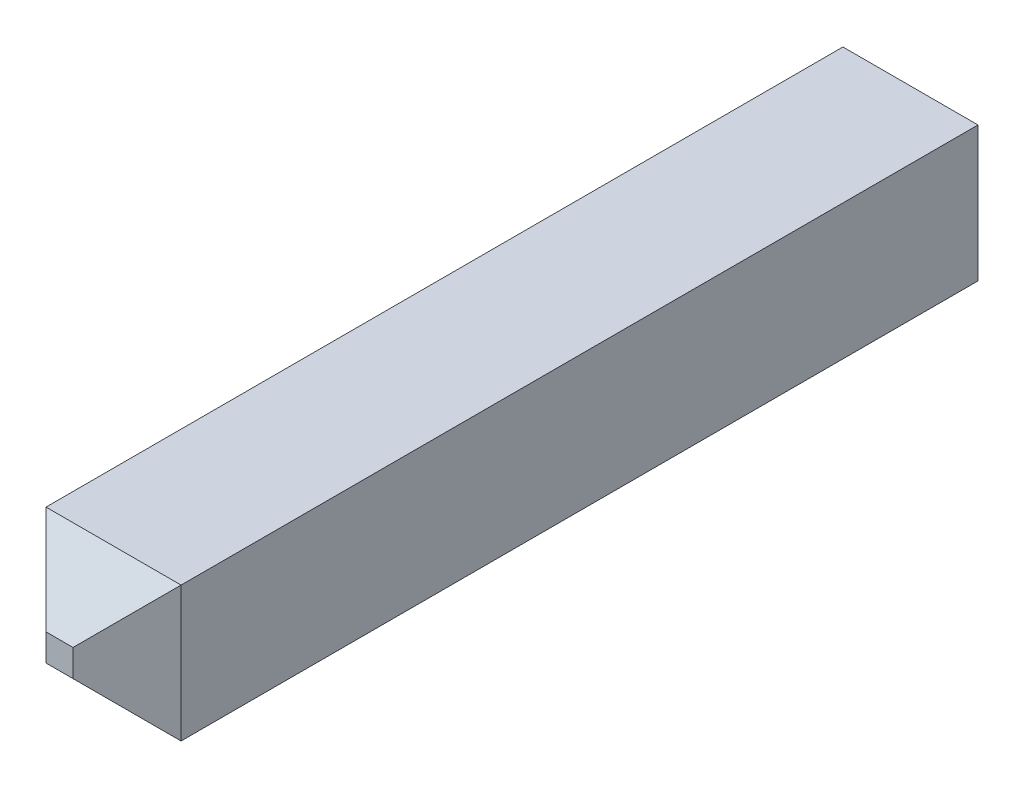
ISO-10303-21;
HEADER;
FILE_DESCRIPTION(('STEP AP214'),'2;1');
FILE_NAME('part.step','',(''),(''),'','','');
FILE_SCHEMA(('AUTOMOTIVE_DESIGN { 1 0 10303 214 1 1 1 1 }'));
ENDSEC;
DATA;
#1=APPLICATION_CONTEXT('core data for automotive mechanical design processes');
#2=APPLICATION_PROTOCOL_DEFINITION('international standard','automotive_design',2000,#1);
#3=PRODUCT_CONTEXT('',#1,'mechanical');
#4=PRODUCT('Part','Part','',(#3));
#5=PRODUCT_RELATED_PRODUCT_CATEGORY('part','',(#4));
#6=PRODUCT_DEFINITION_FORMATION('','',#4);
#7=PRODUCT_DEFINITION_CONTEXT('part definition',#1,'design');
#8=PRODUCT_DEFINITION('design','',#6,#7);
#9=PRODUCT_DEFINITION_SHAPE('','',#8);
#10=(LENGTH_UNIT() NAMED_UNIT(*) SI_UNIT(.MILLI.,.METRE.));
#11=(NAMED_UNIT(*) PLANE_ANGLE_UNIT() SI_UNIT($,.RADIAN.));
#12=(NAMED_UNIT(*) SI_UNIT($,.STERADIAN.) SOLID_ANGLE_UNIT());
#13=UNCERTAINTY_MEASURE_WITH_UNIT(LENGTH_MEASURE(1.E-05),#10,'distance_accuracy_value','');
#14=(GEOMETRIC_REPRESENTATION_CONTEXT(3) GLOBAL_UNCERTAINTY_ASSIGNED_CONTEXT((#13)) GLOBAL_UNIT_ASSIGNED_CONTEXT((#10,
#11,#12)) REPRESENTATION_CONTEXT('',''));
#15=CARTESIAN_POINT('',(0.,0.,0.));
#16=DIRECTION('',(0.,0.,1.));
#17=DIRECTION('',(1.,0.,0.));
#18=AXIS2_PLACEMENT_3D('',#15,#16,#17);
#19=CARTESIAN_POINT('',(-2.625,-2.9,3.05));
#20=DIRECTION('',(0.,-0.707106781186548,0.707106781186548));
#21=DIRECTION('',(0.,-0.707106781186548,-0.707106781186548));
#22=AXIS2_PLACEMENT_3D('',#19,#20,#21);
#23=PLANE('',#22);
#24=DIRECTION('',(1.,0.,0.));
#25=VECTOR('',#24,1.);
#26=CARTESIAN_POINT('',(-2.5,-3.,2.95));
#27=LINE('',#26,#25);
#28=CARTESIAN_POINT('',(-2.5,-3.,2.95));
#29=VERTEX_POINT('',#28);
#30=CARTESIAN_POINT('',(-3.,-3.,2.95));
#31=VERTEX_POINT('',#30);
#32=EDGE_CURVE('E78',#29,#31,#27,.F.);
#33=ORIENTED_EDGE('',*,*,#32,.F.);
#34=DIRECTION('',(0.577350269189625,-0.577350269189628,-0.577350269189625));
#35=VECTOR('',#34,1.);
#36=CARTESIAN_POINT('',(-2.7,-2.8,3.15));
#37=LINE('',#36,#35);
#38=CARTESIAN_POINT('',(-2.7,-2.8,3.15));
#39=VERTEX_POINT('',#38);
#40=EDGE_CURVE('E76',#39,#29,#37,.T.);
#41=ORIENTED_EDGE('',*,*,#40,.F.);
#42=DIRECTION('',(1.,0.,0.));
#43=VECTOR('',#42,1.);
#44=CARTESIAN_POINT('',(-2.75,-2.8,3.15));
#45=LINE('',#44,#43);
#46=CARTESIAN_POINT('',(-2.8,-2.8,3.15));
#47=VERTEX_POINT('',#46);
#48=EDGE_CURVE('E19',#47,#39,#45,.T.);
#49=ORIENTED_EDGE('',*,*,#48,.F.);
#50=DIRECTION('',(0.577350269189626,0.577350269189626,0.577350269189626));
#51=VECTOR('',#50,1.);
#52=CARTESIAN_POINT('',(-3.,-3.,2.95));
#53=LINE('',#52,#51);
#54=EDGE_CURVE('E88',#31,#47,#53,.T.);
#55=ORIENTED_EDGE('',*,*,#54,.F.);
#56=EDGE_LOOP('',(#33,#41,#49,#55));
#57=FACE_BOUND('',#56,.T.);
#58=ADVANCED_FACE('F16',(#57),#23,.T.);
#59=CARTESIAN_POINT('',(-2.75,-2.75,3.15));
#60=DIRECTION('',(0.,0.,1.));
#61=DIRECTION('',(1.,0.,0.));
#62=AXIS2_PLACEMENT_3D('',#59,#60,#61);
#63=PLANE('',#62);
#64=DIRECTION('',(0.,1.,0.));
#65=VECTOR('',#64,1.);
#66=CARTESIAN_POINT('',(-2.7,-2.625,3.15));
#67=LINE('',#66,#65);
#68=CARTESIAN_POINT('',(-2.7,-2.7,3.15));
#69=VERTEX_POINT('',#68);
#70=EDGE_CURVE('E70',#69,#39,#67,.F.);
#71=ORIENTED_EDGE('',*,*,#70,.F.);
#72=DIRECTION('',(1.,0.,0.));
#73=VECTOR('',#72,1.);
#74=CARTESIAN_POINT('',(-2.875,-2.7,3.15));
#75=LINE('',#74,#73);
#76=CARTESIAN_POINT('',(-2.8,-2.7,3.15));
#77=VERTEX_POINT('',#76);
#78=EDGE_CURVE('E91',#77,#69,#75,.T.);
#79=ORIENTED_EDGE('',*,*,#78,.F.);
#80=DIRECTION('',(0.,1.,0.));
#81=VECTOR('',#80,1.);
#82=CARTESIAN_POINT('',(-2.8,-2.875,3.15));
#83=LINE('',#82,#81);
#84=EDGE_CURVE('E73',#47,#77,#83,.T.);
#85=ORIENTED_EDGE('',*,*,#84,.F.);
#86=ORIENTED_EDGE('',*,*,#48,.T.);
#87=EDGE_LOOP('',(#71,#79,#85,#86));
#88=FACE_BOUND('',#87,.T.);
#89=ADVANCED_FACE('F68',(#88),#63,.T.);
#90=CARTESIAN_POINT('',(-2.6,-2.625,3.05));
#91=DIRECTION('',(0.707106781186548,0.,0.707106781186547));
#92=DIRECTION('',(0.707106781186547,0.,-0.707106781186548));
#93=AXIS2_PLACEMENT_3D('',#90,#91,#92);
#94=PLANE('',#93);
#95=DIRECTION('',(0.,1.,0.));
#96=VECTOR('',#95,1.);
#97=CARTESIAN_POINT('',(-2.5,-2.5,2.95));
#98=LINE('',#97,#96);
#99=CARTESIAN_POINT('',(-2.5,-2.5,2.95));
#100=VERTEX_POINT('',#99);
#101=EDGE_CURVE('E97',#100,#29,#98,.F.);
#102=ORIENTED_EDGE('',*,*,#101,.F.);
#103=DIRECTION('',(0.577350269189626,0.577350269189626,-0.577350269189625));
#104=VECTOR('',#103,1.);
#105=CARTESIAN_POINT('',(-2.7,-2.7,3.15));
#106=LINE('',#105,#104);
#107=EDGE_CURVE('E84',#69,#100,#106,.T.);
#108=ORIENTED_EDGE('',*,*,#107,.F.);
#109=ORIENTED_EDGE('',*,*,#70,.T.);
#110=ORIENTED_EDGE('',*,*,#40,.T.);
#111=EDGE_LOOP('',(#102,#108,#109,#110));
#112=FACE_BOUND('',#111,.T.);
#113=ADVANCED_FACE('F82',(#112),#94,.T.);
#114=CARTESIAN_POINT('',(-2.9,-2.875,3.05));
#115=DIRECTION('',(-0.707106781186548,0.,0.707106781186548));
#116=DIRECTION('',(0.707106781186548,0.,0.707106781186548));
#117=AXIS2_PLACEMENT_3D('',#114,#115,#116);
#118=PLANE('',#117);
#119=DIRECTION('',(0.,1.,0.));
#120=VECTOR('',#119,1.);
#121=CARTESIAN_POINT('',(-3.,-3.,2.95));
#122=LINE('',#121,#120);
#123=CARTESIAN_POINT('',(-3.,-2.5,2.95));
#124=VERTEX_POINT('',#123);
#125=EDGE_CURVE('E107',#31,#124,#122,.T.);
#126=ORIENTED_EDGE('',*,*,#125,.F.);
#127=ORIENTED_EDGE('',*,*,#54,.T.);
#128=ORIENTED_EDGE('',*,*,#84,.T.);
#129=DIRECTION('',(0.577350269189626,-0.577350269189626,0.577350269189625));
#130=VECTOR('',#129,1.);
#131=CARTESIAN_POINT('',(-3.,-2.5,2.95));
#132=LINE('',#131,#130);
#133=EDGE_CURVE('E94',#124,#77,#132,.T.);
#134=ORIENTED_EDGE('',*,*,#133,.F.);
#135=EDGE_LOOP('',(#126,#127,#128,#134));
#136=FACE_BOUND('',#135,.T.);
#137=ADVANCED_FACE('F135',(#136),#118,.T.);
#138=CARTESIAN_POINT('',(-2.5,-3.,0.));
#139=DIRECTION('',(0.,-1.,0.));
#140=DIRECTION('',(0.,0.,-1.));
#141=AXIS2_PLACEMENT_3D('',#138,#139,#140);
#142=PLANE('',#141);
#143=DIRECTION('',(1.,0.,0.));
#144=VECTOR('',#143,1.);
#145=CARTESIAN_POINT('',(-2.75,-3.,0.));
#146=LINE('',#145,#144);
#147=CARTESIAN_POINT('',(-3.,-3.,0.));
#148=VERTEX_POINT('',#147);
#149=CARTESIAN_POINT('',(-2.5,-3.,0.));
#150=VERTEX_POINT('',#149);
#151=EDGE_CURVE('E103',#148,#150,#146,.T.);
#152=ORIENTED_EDGE('',*,*,#151,.T.);
#153=DIRECTION('',(0.,0.,-1.));
#154=VECTOR('',#153,1.);
#155=CARTESIAN_POINT('',(-2.5,-3.,0.));
#156=LINE('',#155,#154);
#157=EDGE_CURVE('E100',#29,#150,#156,.T.);
#158=ORIENTED_EDGE('',*,*,#157,.F.);
#159=ORIENTED_EDGE('',*,*,#32,.T.);
#160=DIRECTION('',(0.,0.,1.));
#161=VECTOR('',#160,1.);
#162=CARTESIAN_POINT('',(-3.,-3.,0.));
#163=LINE('',#162,#161);
#164=EDGE_CURVE('E111',#148,#31,#163,.T.);
#165=ORIENTED_EDGE('',*,*,#164,.F.);
#166=EDGE_LOOP('',(#152,#158,#159,#165));
#167=FACE_BOUND('',#166,.T.);
#168=ADVANCED_FACE('F130',(#167),#142,.T.);
#169=CARTESIAN_POINT('',(-2.875,-2.6,3.05));
#170=DIRECTION('',(0.,0.707106781186547,0.707106781186548));
#171=DIRECTION('',(0.,-0.707106781186548,0.707106781186547));
#172=AXIS2_PLACEMENT_3D('',#169,#170,#171);
#173=PLANE('',#172);
#174=DIRECTION('',(1.,0.,0.));
#175=VECTOR('',#174,1.);
#176=CARTESIAN_POINT('',(-3.,-2.5,2.95));
#177=LINE('',#176,#175);
#178=EDGE_CURVE('E114',#124,#100,#177,.T.);
#179=ORIENTED_EDGE('',*,*,#178,.F.);
#180=ORIENTED_EDGE('',*,*,#133,.T.);
#181=ORIENTED_EDGE('',*,*,#78,.T.);
#182=ORIENTED_EDGE('',*,*,#107,.T.);
#183=EDGE_LOOP('',(#179,#180,#181,#182));
#184=FACE_BOUND('',#183,.T.);
#185=ADVANCED_FACE('F138',(#184),#173,.T.);
#186=CARTESIAN_POINT('',(-2.5,-2.5,0.));
#187=DIRECTION('',(1.,0.,0.));
#188=DIRECTION('',(0.,0.,-1.));
#189=AXIS2_PLACEMENT_3D('',#186,#187,#188);
#190=PLANE('',#189);
#191=DIRECTION('',(0.,1.,0.));
#192=VECTOR('',#191,1.);
#193=CARTESIAN_POINT('',(-2.5,-2.75,0.));
#194=LINE('',#193,#192);
#195=CARTESIAN_POINT('',(-2.5,-2.5,0.));
#196=VERTEX_POINT('',#195);
#197=EDGE_CURVE('E105',#150,#196,#194,.T.);
#198=ORIENTED_EDGE('',*,*,#197,.T.);
#199=DIRECTION('',(0.,0.,1.));
#200=VECTOR('',#199,1.);
#201=CARTESIAN_POINT('',(-2.5,-2.5,0.));
#202=LINE('',#201,#200);
#203=EDGE_CURVE('E117',#100,#196,#202,.F.);
#204=ORIENTED_EDGE('',*,*,#203,.F.);
#205=ORIENTED_EDGE('',*,*,#101,.T.);
#206=ORIENTED_EDGE('',*,*,#157,.T.);
#207=EDGE_LOOP('',(#198,#204,#205,#206));
#208=FACE_BOUND('',#207,.T.);
#209=ADVANCED_FACE('F128',(#208),#190,.T.);
#210=CARTESIAN_POINT('',(-2.75,-2.75,0.));
#211=DIRECTION('',(0.,0.,1.));
#212=DIRECTION('',(1.,0.,0.));
#213=AXIS2_PLACEMENT_3D('',#210,#211,#212);
#214=PLANE('',#213);
#215=ORIENTED_EDGE('',*,*,#197,.F.);
#216=ORIENTED_EDGE('',*,*,#151,.F.);
#217=DIRECTION('',(0.,1.,0.));
#218=VECTOR('',#217,1.);
#219=CARTESIAN_POINT('',(-3.,-3.,0.));
#220=LINE('',#219,#218);
#221=CARTESIAN_POINT('',(-3.,-2.5,0.));
#222=VERTEX_POINT('',#221);
#223=EDGE_CURVE('E34',#222,#148,#220,.F.);
#224=ORIENTED_EDGE('',*,*,#223,.F.);
#225=DIRECTION('',(1.,0.,0.));
#226=VECTOR('',#225,1.);
#227=CARTESIAN_POINT('',(-3.,-2.5,0.));
#228=LINE('',#227,#226);
#229=EDGE_CURVE('E25',#196,#222,#228,.F.);
#230=ORIENTED_EDGE('',*,*,#229,.F.);
#231=EDGE_LOOP('',(#215,#216,#224,#230));
#232=FACE_BOUND('',#231,.T.);
#233=ADVANCED_FACE('F125',(#232),#214,.F.);
#234=CARTESIAN_POINT('',(-3.,-3.,0.));
#235=DIRECTION('',(-1.,0.,0.));
#236=DIRECTION('',(0.,0.,1.));
#237=AXIS2_PLACEMENT_3D('',#234,#235,#236);
#238=PLANE('',#237);
#239=ORIENTED_EDGE('',*,*,#223,.T.);
#240=ORIENTED_EDGE('',*,*,#164,.T.);
#241=ORIENTED_EDGE('',*,*,#125,.T.);
#242=DIRECTION('',(0.,0.,1.));
#243=VECTOR('',#242,1.);
#244=CARTESIAN_POINT('',(-3.,-2.5,0.));
#245=LINE('',#244,#243);
#246=EDGE_CURVE('E10',#222,#124,#245,.T.);
#247=ORIENTED_EDGE('',*,*,#246,.F.);
#248=EDGE_LOOP('',(#239,#240,#241,#247));
#249=FACE_BOUND('',#248,.T.);
#250=ADVANCED_FACE('F132',(#249),#238,.T.);
#251=CARTESIAN_POINT('',(-3.,-2.5,0.));
#252=DIRECTION('',(0.,1.,0.));
#253=DIRECTION('',(0.,0.,1.));
#254=AXIS2_PLACEMENT_3D('',#251,#252,#253);
#255=PLANE('',#254);
#256=ORIENTED_EDGE('',*,*,#229,.T.);
#257=ORIENTED_EDGE('',*,*,#246,.T.);
#258=ORIENTED_EDGE('',*,*,#178,.T.);
#259=ORIENTED_EDGE('',*,*,#203,.T.);
#260=EDGE_LOOP('',(#256,#257,#258,#259));
#261=FACE_BOUND('',#260,.T.);
#262=ADVANCED_FACE('F122',(#261),#255,.T.);
#263=CLOSED_SHELL('',(#58,#89,#113,#137,#168,#185,#209,#233,#250,#262));
#264=MANIFOLD_SOLID_BREP('B1',#263);
#265=ADVANCED_BREP_SHAPE_REPRESENTATION('',(#18,#264),#14);
#266=SHAPE_DEFINITION_REPRESENTATION(#9,#265);
ENDSEC;
END-ISO-10303-21;
